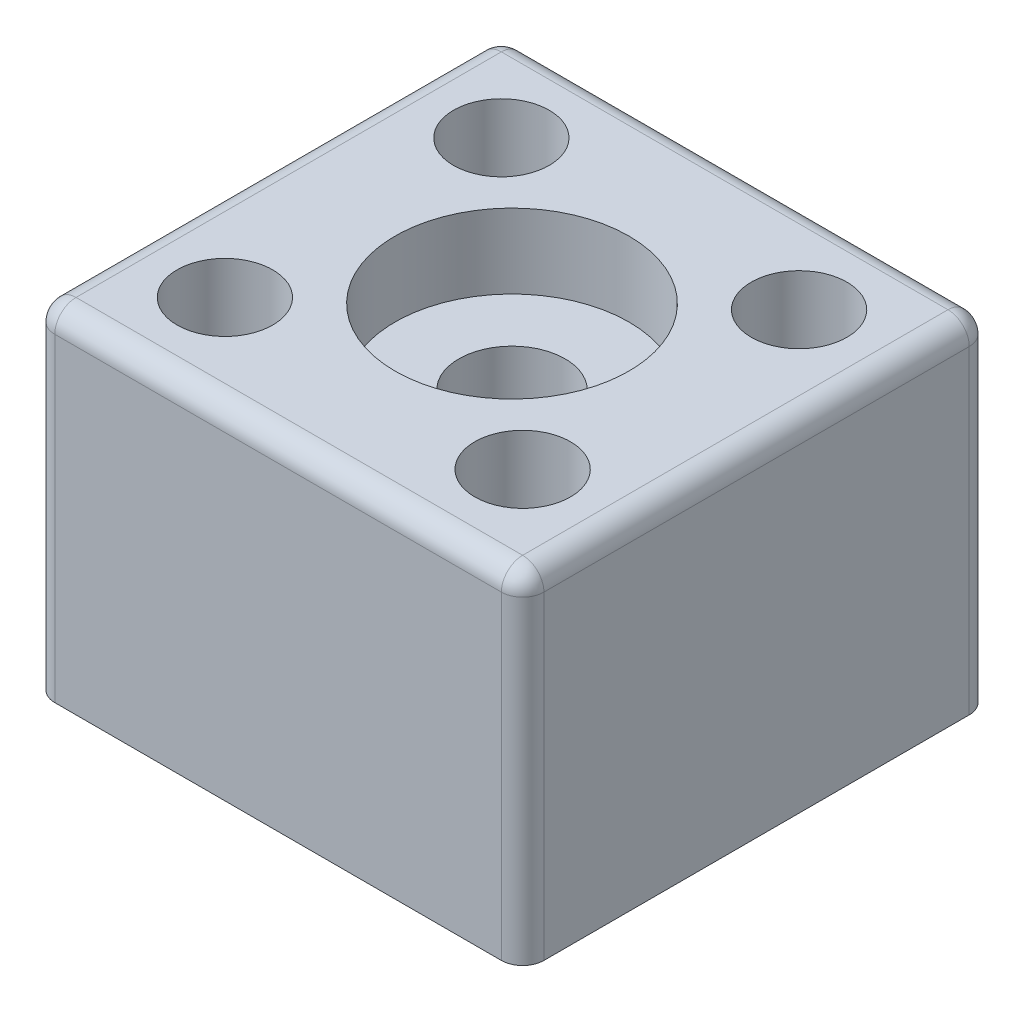
ISO-10303-21;
HEADER;
FILE_DESCRIPTION(('STEP AP214'),'2;1');
FILE_NAME('part.step','',(''),(''),'','','');
FILE_SCHEMA(('AUTOMOTIVE_DESIGN { 1 0 10303 214 1 1 1 1 }'));
ENDSEC;
DATA;
#1=APPLICATION_CONTEXT('core data for automotive mechanical design processes');
#2=APPLICATION_PROTOCOL_DEFINITION('international standard','automotive_design',2000,#1);
#3=PRODUCT_CONTEXT('',#1,'mechanical');
#4=PRODUCT('Part','Part','',(#3));
#5=PRODUCT_RELATED_PRODUCT_CATEGORY('part','',(#4));
#6=PRODUCT_DEFINITION_FORMATION('','',#4);
#7=PRODUCT_DEFINITION_CONTEXT('part definition',#1,'design');
#8=PRODUCT_DEFINITION('design','',#6,#7);
#9=PRODUCT_DEFINITION_SHAPE('','',#8);
#10=(LENGTH_UNIT() NAMED_UNIT(*) SI_UNIT(.MILLI.,.METRE.));
#11=(NAMED_UNIT(*) PLANE_ANGLE_UNIT() SI_UNIT($,.RADIAN.));
#12=(NAMED_UNIT(*) SI_UNIT($,.STERADIAN.) SOLID_ANGLE_UNIT());
#13=UNCERTAINTY_MEASURE_WITH_UNIT(LENGTH_MEASURE(1.E-05),#10,'distance_accuracy_value','');
#14=(GEOMETRIC_REPRESENTATION_CONTEXT(3) GLOBAL_UNCERTAINTY_ASSIGNED_CONTEXT((#13)) GLOBAL_UNIT_ASSIGNED_CONTEXT((#10,
#11,#12)) REPRESENTATION_CONTEXT('',''));
#15=CARTESIAN_POINT('',(0.,0.,0.));
#16=DIRECTION('',(0.,0.,1.));
#17=DIRECTION('',(1.,0.,0.));
#18=AXIS2_PLACEMENT_3D('',#15,#16,#17);
#19=CARTESIAN_POINT('',(14.,32.,-13.));
#20=DIRECTION('',(0.,-1.,0.));
#21=DIRECTION('',(0.,0.,-1.));
#22=AXIS2_PLACEMENT_3D('',#19,#20,#21);
#23=CYLINDRICAL_SURFACE('',#22,2.65);
#24=CARTESIAN_POINT('',(14.,0.,-13.));
#25=DIRECTION('',(0.,-1.,0.));
#26=DIRECTION('',(0.,0.,-1.));
#27=AXIS2_PLACEMENT_3D('',#24,#25,#26);
#28=CIRCLE('',#27,2.65);
#29=CARTESIAN_POINT('',(14.,0.,-15.65));
#30=VERTEX_POINT('',#29);
#31=EDGE_CURVE('E166',#30,#30,#28,.T.);
#32=ORIENTED_EDGE('',*,*,#31,.T.);
#33=EDGE_LOOP('',(#32));
#34=FACE_BOUND('',#33,.T.);
#35=CARTESIAN_POINT('',(14.,10.,-13.));
#36=DIRECTION('',(0.,1.,0.));
#37=DIRECTION('',(0.,0.,1.));
#38=AXIS2_PLACEMENT_3D('',#35,#36,#37);
#39=CIRCLE('',#38,2.65);
#40=CARTESIAN_POINT('',(14.,10.,-10.35));
#41=VERTEX_POINT('',#40);
#42=EDGE_CURVE('E280',#41,#41,#39,.F.);
#43=ORIENTED_EDGE('',*,*,#42,.F.);
#44=EDGE_LOOP('',(#43));
#45=FACE_BOUND('',#44,.T.);
#46=ADVANCED_FACE('F41',(#34,#45),#23,.F.);
#47=CARTESIAN_POINT('',(-14.,32.,-13.));
#48=DIRECTION('',(0.,-1.,0.));
#49=DIRECTION('',(0.,0.,-1.));
#50=AXIS2_PLACEMENT_3D('',#47,#48,#49);
#51=CYLINDRICAL_SURFACE('',#50,2.65);
#52=CARTESIAN_POINT('',(-14.,0.,-13.));
#53=DIRECTION('',(0.,-1.,0.));
#54=DIRECTION('',(0.,0.,-1.));
#55=AXIS2_PLACEMENT_3D('',#52,#53,#54);
#56=CIRCLE('',#55,2.65);
#57=CARTESIAN_POINT('',(-14.,0.,-15.65));
#58=VERTEX_POINT('',#57);
#59=EDGE_CURVE('E149',#58,#58,#56,.T.);
#60=ORIENTED_EDGE('',*,*,#59,.T.);
#61=EDGE_LOOP('',(#60));
#62=FACE_BOUND('',#61,.T.);
#63=CARTESIAN_POINT('',(-14.,10.,-13.));
#64=DIRECTION('',(0.,1.,0.));
#65=DIRECTION('',(0.,0.,1.));
#66=AXIS2_PLACEMENT_3D('',#63,#64,#65);
#67=CIRCLE('',#66,2.65);
#68=CARTESIAN_POINT('',(-14.,10.,-10.35));
#69=VERTEX_POINT('',#68);
#70=EDGE_CURVE('E276',#69,#69,#67,.F.);
#71=ORIENTED_EDGE('',*,*,#70,.F.);
#72=EDGE_LOOP('',(#71));
#73=FACE_BOUND('',#72,.T.);
#74=ADVANCED_FACE('F317',(#62,#73),#51,.F.);
#75=CARTESIAN_POINT('',(-14.,32.,13.));
#76=DIRECTION('',(0.,-1.,0.));
#77=DIRECTION('',(0.,0.,-1.));
#78=AXIS2_PLACEMENT_3D('',#75,#76,#77);
#79=CYLINDRICAL_SURFACE('',#78,2.65);
#80=CARTESIAN_POINT('',(-14.,0.,13.));
#81=DIRECTION('',(0.,-1.,0.));
#82=DIRECTION('',(0.,0.,-1.));
#83=AXIS2_PLACEMENT_3D('',#80,#81,#82);
#84=CIRCLE('',#83,2.65);
#85=CARTESIAN_POINT('',(-14.,0.,10.35));
#86=VERTEX_POINT('',#85);
#87=EDGE_CURVE('E156',#86,#86,#84,.T.);
#88=ORIENTED_EDGE('',*,*,#87,.T.);
#89=EDGE_LOOP('',(#88));
#90=FACE_BOUND('',#89,.T.);
#91=CARTESIAN_POINT('',(-14.,10.,13.));
#92=DIRECTION('',(0.,1.,0.));
#93=DIRECTION('',(0.,0.,1.));
#94=AXIS2_PLACEMENT_3D('',#91,#92,#93);
#95=CIRCLE('',#94,2.65);
#96=CARTESIAN_POINT('',(-14.,10.,15.65));
#97=VERTEX_POINT('',#96);
#98=EDGE_CURVE('E272',#97,#97,#95,.F.);
#99=ORIENTED_EDGE('',*,*,#98,.F.);
#100=EDGE_LOOP('',(#99));
#101=FACE_BOUND('',#100,.T.);
#102=ADVANCED_FACE('F306',(#90,#101),#79,.F.);
#103=CARTESIAN_POINT('',(14.,32.,13.));
#104=DIRECTION('',(0.,-1.,0.));
#105=DIRECTION('',(0.,0.,-1.));
#106=AXIS2_PLACEMENT_3D('',#103,#104,#105);
#107=CYLINDRICAL_SURFACE('',#106,2.65);
#108=CARTESIAN_POINT('',(14.,0.,13.));
#109=DIRECTION('',(0.,-1.,0.));
#110=DIRECTION('',(0.,0.,-1.));
#111=AXIS2_PLACEMENT_3D('',#108,#109,#110);
#112=CIRCLE('',#111,2.65);
#113=CARTESIAN_POINT('',(14.,0.,10.35));
#114=VERTEX_POINT('',#113);
#115=EDGE_CURVE('E170',#114,#114,#112,.T.);
#116=ORIENTED_EDGE('',*,*,#115,.T.);
#117=EDGE_LOOP('',(#116));
#118=FACE_BOUND('',#117,.T.);
#119=CARTESIAN_POINT('',(14.,10.,13.));
#120=DIRECTION('',(0.,1.,0.));
#121=DIRECTION('',(0.,0.,1.));
#122=AXIS2_PLACEMENT_3D('',#119,#120,#121);
#123=CIRCLE('',#122,2.65);
#124=CARTESIAN_POINT('',(14.,10.,15.65));
#125=VERTEX_POINT('',#124);
#126=EDGE_CURVE('E224',#125,#125,#123,.F.);
#127=ORIENTED_EDGE('',*,*,#126,.F.);
#128=EDGE_LOOP('',(#127));
#129=FACE_BOUND('',#128,.T.);
#130=ADVANCED_FACE('F349',(#118,#129),#107,.F.);
#131=CARTESIAN_POINT('',(23.,32.,-22.));
#132=DIRECTION('',(-1.,0.,0.));
#133=DIRECTION('',(0.,0.,1.));
#134=AXIS2_PLACEMENT_3D('',#131,#132,#133);
#135=PLANE('',#134);
#136=DIRECTION('',(0.,0.,-1.));
#137=VECTOR('',#136,1.);
#138=CARTESIAN_POINT('',(23.,30.,22.));
#139=LINE('',#138,#137);
#140=CARTESIAN_POINT('',(23.,30.,-20.));
#141=VERTEX_POINT('',#140);
#142=CARTESIAN_POINT('',(23.,30.,20.));
#143=VERTEX_POINT('',#142);
#144=EDGE_CURVE('E138',#141,#143,#139,.F.);
#145=ORIENTED_EDGE('',*,*,#144,.T.);
#146=DIRECTION('',(0.,-1.,0.));
#147=VECTOR('',#146,1.);
#148=CARTESIAN_POINT('',(23.,32.,20.));
#149=LINE('',#148,#147);
#150=CARTESIAN_POINT('',(23.,0.,20.));
#151=VERTEX_POINT('',#150);
#152=EDGE_CURVE('E122',#143,#151,#149,.T.);
#153=ORIENTED_EDGE('',*,*,#152,.T.);
#154=DIRECTION('',(0.,0.,-1.));
#155=VECTOR('',#154,1.);
#156=CARTESIAN_POINT('',(23.,0.,-22.));
#157=LINE('',#156,#155);
#158=CARTESIAN_POINT('',(23.,0.,-20.));
#159=VERTEX_POINT('',#158);
#160=EDGE_CURVE('E135',#151,#159,#157,.T.);
#161=ORIENTED_EDGE('',*,*,#160,.T.);
#162=DIRECTION('',(0.,-1.,0.));
#163=VECTOR('',#162,1.);
#164=CARTESIAN_POINT('',(23.,32.,-20.));
#165=LINE('',#164,#163);
#166=EDGE_CURVE('E174',#159,#141,#165,.F.);
#167=ORIENTED_EDGE('',*,*,#166,.T.);
#168=EDGE_LOOP('',(#145,#153,#161,#167));
#169=FACE_BOUND('',#168,.T.);
#170=ADVANCED_FACE('F134',(#169),#135,.F.);
#171=CARTESIAN_POINT('',(-23.,32.,-22.));
#172=DIRECTION('',(0.,0.,1.));
#173=DIRECTION('',(1.,0.,0.));
#174=AXIS2_PLACEMENT_3D('',#171,#172,#173);
#175=PLANE('',#174);
#176=DIRECTION('',(-1.,0.,0.));
#177=VECTOR('',#176,1.);
#178=CARTESIAN_POINT('',(-23.,0.,-22.));
#179=LINE('',#178,#177);
#180=CARTESIAN_POINT('',(21.,0.,-22.));
#181=VERTEX_POINT('',#180);
#182=CARTESIAN_POINT('',(-21.,0.,-22.));
#183=VERTEX_POINT('',#182);
#184=EDGE_CURVE('E148',#181,#183,#179,.T.);
#185=ORIENTED_EDGE('',*,*,#184,.T.);
#186=DIRECTION('',(0.,-1.,0.));
#187=VECTOR('',#186,1.);
#188=CARTESIAN_POINT('',(-21.,32.,-22.));
#189=LINE('',#188,#187);
#190=CARTESIAN_POINT('',(-21.,30.,-22.));
#191=VERTEX_POINT('',#190);
#192=EDGE_CURVE('E11',#183,#191,#189,.F.);
#193=ORIENTED_EDGE('',*,*,#192,.T.);
#194=DIRECTION('',(-1.,0.,0.));
#195=VECTOR('',#194,1.);
#196=CARTESIAN_POINT('',(23.,30.,-22.));
#197=LINE('',#196,#195);
#198=CARTESIAN_POINT('',(21.,30.,-22.));
#199=VERTEX_POINT('',#198);
#200=EDGE_CURVE('E51',#191,#199,#197,.F.);
#201=ORIENTED_EDGE('',*,*,#200,.T.);
#202=DIRECTION('',(0.,-1.,0.));
#203=VECTOR('',#202,1.);
#204=CARTESIAN_POINT('',(21.,32.,-22.));
#205=LINE('',#204,#203);
#206=EDGE_CURVE('E215',#199,#181,#205,.T.);
#207=ORIENTED_EDGE('',*,*,#206,.T.);
#208=EDGE_LOOP('',(#185,#193,#201,#207));
#209=FACE_BOUND('',#208,.T.);
#210=ADVANCED_FACE('F406',(#209),#175,.F.);
#211=CARTESIAN_POINT('',(-23.,32.,-22.));
#212=DIRECTION('',(1.,0.,0.));
#213=DIRECTION('',(0.,0.,-1.));
#214=AXIS2_PLACEMENT_3D('',#211,#212,#213);
#215=PLANE('',#214);
#216=DIRECTION('',(0.,0.,1.));
#217=VECTOR('',#216,1.);
#218=CARTESIAN_POINT('',(-23.,0.,-22.));
#219=LINE('',#218,#217);
#220=CARTESIAN_POINT('',(-23.,0.,-20.));
#221=VERTEX_POINT('',#220);
#222=CARTESIAN_POINT('',(-23.,0.,20.));
#223=VERTEX_POINT('',#222);
#224=EDGE_CURVE('E153',#221,#223,#219,.T.);
#225=ORIENTED_EDGE('',*,*,#224,.T.);
#226=DIRECTION('',(0.,-1.,0.));
#227=VECTOR('',#226,1.);
#228=CARTESIAN_POINT('',(-23.,32.,20.));
#229=LINE('',#228,#227);
#230=CARTESIAN_POINT('',(-23.,30.,20.));
#231=VERTEX_POINT('',#230);
#232=EDGE_CURVE('E212',#223,#231,#229,.F.);
#233=ORIENTED_EDGE('',*,*,#232,.T.);
#234=DIRECTION('',(0.,0.,1.));
#235=VECTOR('',#234,1.);
#236=CARTESIAN_POINT('',(-23.,30.,-22.));
#237=LINE('',#236,#235);
#238=CARTESIAN_POINT('',(-23.,30.,-20.));
#239=VERTEX_POINT('',#238);
#240=EDGE_CURVE('E209',#231,#239,#237,.F.);
#241=ORIENTED_EDGE('',*,*,#240,.T.);
#242=DIRECTION('',(0.,-1.,0.));
#243=VECTOR('',#242,1.);
#244=CARTESIAN_POINT('',(-23.,32.,-20.));
#245=LINE('',#244,#243);
#246=EDGE_CURVE('E206',#239,#221,#245,.T.);
#247=ORIENTED_EDGE('',*,*,#246,.T.);
#248=EDGE_LOOP('',(#225,#233,#241,#247));
#249=FACE_BOUND('',#248,.T.);
#250=ADVANCED_FACE('F411',(#249),#215,.F.);
#251=CARTESIAN_POINT('',(-23.,32.,22.));
#252=DIRECTION('',(0.,0.,-1.));
#253=DIRECTION('',(-1.,0.,0.));
#254=AXIS2_PLACEMENT_3D('',#251,#252,#253);
#255=PLANE('',#254);
#256=DIRECTION('',(1.,0.,0.));
#257=VECTOR('',#256,1.);
#258=CARTESIAN_POINT('',(-23.,0.,22.));
#259=LINE('',#258,#257);
#260=CARTESIAN_POINT('',(-21.,0.,22.));
#261=VERTEX_POINT('',#260);
#262=CARTESIAN_POINT('',(21.,0.,22.));
#263=VERTEX_POINT('',#262);
#264=EDGE_CURVE('E163',#261,#263,#259,.T.);
#265=ORIENTED_EDGE('',*,*,#264,.T.);
#266=DIRECTION('',(0.,-1.,0.));
#267=VECTOR('',#266,1.);
#268=CARTESIAN_POINT('',(21.,32.,22.));
#269=LINE('',#268,#267);
#270=CARTESIAN_POINT('',(21.,30.,22.));
#271=VERTEX_POINT('',#270);
#272=EDGE_CURVE('E123',#263,#271,#269,.F.);
#273=ORIENTED_EDGE('',*,*,#272,.T.);
#274=DIRECTION('',(1.,0.,0.));
#275=VECTOR('',#274,1.);
#276=CARTESIAN_POINT('',(-23.,30.,22.));
#277=LINE('',#276,#275);
#278=CARTESIAN_POINT('',(-21.,30.,22.));
#279=VERTEX_POINT('',#278);
#280=EDGE_CURVE('E188',#271,#279,#277,.F.);
#281=ORIENTED_EDGE('',*,*,#280,.T.);
#282=DIRECTION('',(0.,-1.,0.));
#283=VECTOR('',#282,1.);
#284=CARTESIAN_POINT('',(-21.,32.,22.));
#285=LINE('',#284,#283);
#286=EDGE_CURVE('E129',#279,#261,#285,.T.);
#287=ORIENTED_EDGE('',*,*,#286,.T.);
#288=EDGE_LOOP('',(#265,#273,#281,#287));
#289=FACE_BOUND('',#288,.T.);
#290=ADVANCED_FACE('F427',(#289),#255,.F.);
#291=CARTESIAN_POINT('',(0.,32.,0.));
#292=DIRECTION('',(0.,1.,0.));
#293=DIRECTION('',(0.,0.,1.));
#294=AXIS2_PLACEMENT_3D('',#291,#292,#293);
#295=PLANE('',#294);
#296=CARTESIAN_POINT('',(14.,32.,-13.));
#297=DIRECTION('',(0.,1.,0.));
#298=DIRECTION('',(0.,0.,1.));
#299=AXIS2_PLACEMENT_3D('',#296,#297,#298);
#300=CIRCLE('',#299,4.5);
#301=CARTESIAN_POINT('',(14.,32.,-8.5));
#302=VERTEX_POINT('',#301);
#303=EDGE_CURVE('E637',#302,#302,#300,.T.);
#304=ORIENTED_EDGE('',*,*,#303,.F.);
#305=EDGE_LOOP('',(#304));
#306=FACE_BOUND('',#305,.T.);
#307=CARTESIAN_POINT('',(-14.,32.,13.));
#308=DIRECTION('',(0.,1.,0.));
#309=DIRECTION('',(0.,0.,1.));
#310=AXIS2_PLACEMENT_3D('',#307,#308,#309);
#311=CIRCLE('',#310,4.5);
#312=CARTESIAN_POINT('',(-14.,32.,17.5));
#313=VERTEX_POINT('',#312);
#314=EDGE_CURVE('E638',#313,#313,#311,.T.);
#315=ORIENTED_EDGE('',*,*,#314,.F.);
#316=EDGE_LOOP('',(#315));
#317=FACE_BOUND('',#316,.T.);
#318=CARTESIAN_POINT('',(-14.,32.,-13.));
#319=DIRECTION('',(0.,1.,0.));
#320=DIRECTION('',(0.,0.,1.));
#321=AXIS2_PLACEMENT_3D('',#318,#319,#320);
#322=CIRCLE('',#321,4.5);
#323=CARTESIAN_POINT('',(-14.,32.,-8.5));
#324=VERTEX_POINT('',#323);
#325=EDGE_CURVE('E650',#324,#324,#322,.T.);
#326=ORIENTED_EDGE('',*,*,#325,.F.);
#327=EDGE_LOOP('',(#326));
#328=FACE_BOUND('',#327,.T.);
#329=CARTESIAN_POINT('',(14.,32.,13.));
#330=DIRECTION('',(0.,1.,0.));
#331=DIRECTION('',(0.,0.,1.));
#332=AXIS2_PLACEMENT_3D('',#329,#330,#331);
#333=CIRCLE('',#332,4.5);
#334=CARTESIAN_POINT('',(14.,32.,17.5));
#335=VERTEX_POINT('',#334);
#336=EDGE_CURVE('E283',#335,#335,#333,.T.);
#337=ORIENTED_EDGE('',*,*,#336,.F.);
#338=EDGE_LOOP('',(#337));
#339=FACE_BOUND('',#338,.T.);
#340=DIRECTION('',(0.,0.,1.));
#341=VECTOR('',#340,1.);
#342=CARTESIAN_POINT('',(-21.,32.,22.));
#343=LINE('',#342,#341);
#344=CARTESIAN_POINT('',(-21.,32.,-20.));
#345=VERTEX_POINT('',#344);
#346=CARTESIAN_POINT('',(-21.,32.,20.));
#347=VERTEX_POINT('',#346);
#348=EDGE_CURVE('E199',#345,#347,#343,.T.);
#349=ORIENTED_EDGE('',*,*,#348,.T.);
#350=DIRECTION('',(1.,0.,0.));
#351=VECTOR('',#350,1.);
#352=CARTESIAN_POINT('',(23.,32.,20.));
#353=LINE('',#352,#351);
#354=CARTESIAN_POINT('',(21.,32.,20.));
#355=VERTEX_POINT('',#354);
#356=EDGE_CURVE('E202',#347,#355,#353,.T.);
#357=ORIENTED_EDGE('',*,*,#356,.T.);
#358=DIRECTION('',(0.,0.,-1.));
#359=VECTOR('',#358,1.);
#360=CARTESIAN_POINT('',(21.,32.,-22.));
#361=LINE('',#360,#359);
#362=CARTESIAN_POINT('',(21.,32.,-20.));
#363=VERTEX_POINT('',#362);
#364=EDGE_CURVE('E196',#355,#363,#361,.T.);
#365=ORIENTED_EDGE('',*,*,#364,.T.);
#366=DIRECTION('',(-1.,0.,0.));
#367=VECTOR('',#366,1.);
#368=CARTESIAN_POINT('',(-23.,32.,-20.));
#369=LINE('',#368,#367);
#370=EDGE_CURVE('E193',#363,#345,#369,.T.);
#371=ORIENTED_EDGE('',*,*,#370,.T.);
#372=EDGE_LOOP('',(#349,#357,#365,#371));
#373=FACE_BOUND('',#372,.T.);
#374=CARTESIAN_POINT('',(0.,32.,0.));
#375=DIRECTION('',(0.,1.,0.));
#376=DIRECTION('',(0.,0.,1.));
#377=AXIS2_PLACEMENT_3D('',#374,#375,#376);
#378=CIRCLE('',#377,11.);
#379=CARTESIAN_POINT('',(0.,32.,11.));
#380=VERTEX_POINT('',#379);
#381=EDGE_CURVE('E267',#380,#380,#378,.T.);
#382=ORIENTED_EDGE('',*,*,#381,.F.);
#383=EDGE_LOOP('',(#382));
#384=FACE_BOUND('',#383,.T.);
#385=ADVANCED_FACE('F312',(#306,#317,#328,#339,#373,#384),#295,.T.);
#386=CARTESIAN_POINT('',(0.,0.,0.));
#387=DIRECTION('',(0.,1.,0.));
#388=DIRECTION('',(0.,0.,1.));
#389=AXIS2_PLACEMENT_3D('',#386,#387,#388);
#390=PLANE('',#389);
#391=CARTESIAN_POINT('',(0.,0.,0.));
#392=DIRECTION('',(0.,1.,0.));
#393=DIRECTION('',(0.,0.,1.));
#394=AXIS2_PLACEMENT_3D('',#391,#392,#393);
#395=CIRCLE('',#394,5.);
#396=CARTESIAN_POINT('',(0.,0.,5.));
#397=VERTEX_POINT('',#396);
#398=EDGE_CURVE('E657',#397,#397,#395,.T.);
#399=ORIENTED_EDGE('',*,*,#398,.T.);
#400=EDGE_LOOP('',(#399));
#401=FACE_BOUND('',#400,.T.);
#402=ORIENTED_EDGE('',*,*,#87,.F.);
#403=EDGE_LOOP('',(#402));
#404=FACE_BOUND('',#403,.T.);
#405=ORIENTED_EDGE('',*,*,#59,.F.);
#406=EDGE_LOOP('',(#405));
#407=FACE_BOUND('',#406,.T.);
#408=ORIENTED_EDGE('',*,*,#160,.F.);
#409=CARTESIAN_POINT('',(21.,0.,20.));
#410=DIRECTION('',(0.,1.,0.));
#411=DIRECTION('',(0.,0.,1.));
#412=AXIS2_PLACEMENT_3D('',#409,#410,#411);
#413=CIRCLE('',#412,2.);
#414=EDGE_CURVE('E118',#151,#263,#413,.F.);
#415=ORIENTED_EDGE('',*,*,#414,.T.);
#416=ORIENTED_EDGE('',*,*,#264,.F.);
#417=CARTESIAN_POINT('',(-21.,0.,20.));
#418=DIRECTION('',(0.,1.,0.));
#419=DIRECTION('',(0.,0.,1.));
#420=AXIS2_PLACEMENT_3D('',#417,#418,#419);
#421=CIRCLE('',#420,2.);
#422=EDGE_CURVE('E130',#261,#223,#421,.F.);
#423=ORIENTED_EDGE('',*,*,#422,.T.);
#424=ORIENTED_EDGE('',*,*,#224,.F.);
#425=CARTESIAN_POINT('',(-21.,0.,-20.));
#426=DIRECTION('',(0.,1.,0.));
#427=DIRECTION('',(0.,0.,1.));
#428=AXIS2_PLACEMENT_3D('',#425,#426,#427);
#429=CIRCLE('',#428,2.);
#430=EDGE_CURVE('E181',#221,#183,#429,.F.);
#431=ORIENTED_EDGE('',*,*,#430,.T.);
#432=ORIENTED_EDGE('',*,*,#184,.F.);
#433=CARTESIAN_POINT('',(21.,0.,-20.));
#434=DIRECTION('',(0.,1.,0.));
#435=DIRECTION('',(0.,0.,1.));
#436=AXIS2_PLACEMENT_3D('',#433,#434,#435);
#437=CIRCLE('',#436,2.);
#438=EDGE_CURVE('E141',#181,#159,#437,.F.);
#439=ORIENTED_EDGE('',*,*,#438,.T.);
#440=EDGE_LOOP('',(#408,#415,#416,#423,#424,#431,#432,#439));
#441=FACE_BOUND('',#440,.T.);
#442=ORIENTED_EDGE('',*,*,#31,.F.);
#443=EDGE_LOOP('',(#442));
#444=FACE_BOUND('',#443,.T.);
#445=ORIENTED_EDGE('',*,*,#115,.F.);
#446=EDGE_LOOP('',(#445));
#447=FACE_BOUND('',#446,.T.);
#448=ADVANCED_FACE('F143',(#401,#404,#407,#441,#444,#447),#390,.F.);
#449=CARTESIAN_POINT('',(0.,25.,0.));
#450=DIRECTION('',(0.,1.,0.));
#451=DIRECTION('',(0.,0.,1.));
#452=AXIS2_PLACEMENT_3D('',#449,#450,#451);
#453=CYLINDRICAL_SURFACE('',#452,11.);
#454=CARTESIAN_POINT('',(0.,25.,0.));
#455=DIRECTION('',(0.,1.,0.));
#456=DIRECTION('',(0.,0.,1.));
#457=AXIS2_PLACEMENT_3D('',#454,#455,#456);
#458=CIRCLE('',#457,11.);
#459=CARTESIAN_POINT('',(0.,25.,11.));
#460=VERTEX_POINT('',#459);
#461=EDGE_CURVE('E296',#460,#460,#458,.T.);
#462=ORIENTED_EDGE('',*,*,#461,.F.);
#463=EDGE_LOOP('',(#462));
#464=FACE_BOUND('',#463,.T.);
#465=ORIENTED_EDGE('',*,*,#381,.T.);
#466=EDGE_LOOP('',(#465));
#467=FACE_BOUND('',#466,.T.);
#468=ADVANCED_FACE('F311',(#464,#467),#453,.F.);
#469=CARTESIAN_POINT('',(0.,25.,0.));
#470=DIRECTION('',(0.,1.,0.));
#471=DIRECTION('',(0.,0.,1.));
#472=AXIS2_PLACEMENT_3D('',#469,#470,#471);
#473=PLANE('',#472);
#474=CARTESIAN_POINT('',(0.,25.,0.));
#475=DIRECTION('',(0.,1.,0.));
#476=DIRECTION('',(0.,0.,1.));
#477=AXIS2_PLACEMENT_3D('',#474,#475,#476);
#478=CIRCLE('',#477,5.);
#479=CARTESIAN_POINT('',(0.,25.,5.));
#480=VERTEX_POINT('',#479);
#481=EDGE_CURVE('E45',#480,#480,#478,.T.);
#482=ORIENTED_EDGE('',*,*,#481,.F.);
#483=EDGE_LOOP('',(#482));
#484=FACE_BOUND('',#483,.T.);
#485=ORIENTED_EDGE('',*,*,#461,.T.);
#486=EDGE_LOOP('',(#485));
#487=FACE_BOUND('',#486,.T.);
#488=ADVANCED_FACE('F397',(#484,#487),#473,.T.);
#489=CARTESIAN_POINT('',(-21.,32.,-20.));
#490=DIRECTION('',(0.,-1.,0.));
#491=DIRECTION('',(0.,0.,-1.));
#492=AXIS2_PLACEMENT_3D('',#489,#490,#491);
#493=CYLINDRICAL_SURFACE('',#492,2.);
#494=CARTESIAN_POINT('',(-21.,30.,-20.));
#495=DIRECTION('',(0.,1.,0.));
#496=DIRECTION('',(0.,0.,1.));
#497=AXIS2_PLACEMENT_3D('',#494,#495,#496);
#498=CIRCLE('',#497,2.);
#499=EDGE_CURVE('E263',#191,#239,#498,.T.);
#500=ORIENTED_EDGE('',*,*,#499,.F.);
#501=ORIENTED_EDGE('',*,*,#192,.F.);
#502=ORIENTED_EDGE('',*,*,#430,.F.);
#503=ORIENTED_EDGE('',*,*,#246,.F.);
#504=EDGE_LOOP('',(#500,#501,#502,#503));
#505=FACE_BOUND('',#504,.T.);
#506=ADVANCED_FACE('F43',(#505),#493,.T.);
#507=CARTESIAN_POINT('',(-21.,30.,-20.));
#508=DIRECTION('',(-1.,0.,0.));
#509=DIRECTION('',(0.,0.,1.));
#510=AXIS2_PLACEMENT_3D('',#507,#508,#509);
#511=SPHERICAL_SURFACE('',#510,2.);
#512=CARTESIAN_POINT('',(-21.,30.,-20.));
#513=DIRECTION('',(-1.,0.,0.));
#514=DIRECTION('',(0.,0.,1.));
#515=AXIS2_PLACEMENT_3D('',#512,#513,#514);
#516=CIRCLE('',#515,2.);
#517=EDGE_CURVE('E255',#191,#345,#516,.F.);
#518=ORIENTED_EDGE('',*,*,#517,.F.);
#519=ORIENTED_EDGE('',*,*,#499,.T.);
#520=CARTESIAN_POINT('',(-21.,30.,-20.));
#521=DIRECTION('',(0.,0.,-1.));
#522=DIRECTION('',(-1.,0.,0.));
#523=AXIS2_PLACEMENT_3D('',#520,#521,#522);
#524=CIRCLE('',#523,2.);
#525=EDGE_CURVE('E259',#345,#239,#524,.F.);
#526=ORIENTED_EDGE('',*,*,#525,.F.);
#527=EDGE_LOOP('',(#518,#519,#526));
#528=FACE_BOUND('',#527,.T.);
#529=ADVANCED_FACE('F390',(#528),#511,.T.);
#530=CARTESIAN_POINT('',(-21.,32.,20.));
#531=DIRECTION('',(0.,-1.,0.));
#532=DIRECTION('',(0.,0.,-1.));
#533=AXIS2_PLACEMENT_3D('',#530,#531,#532);
#534=CYLINDRICAL_SURFACE('',#533,2.);
#535=ORIENTED_EDGE('',*,*,#422,.F.);
#536=ORIENTED_EDGE('',*,*,#286,.F.);
#537=CARTESIAN_POINT('',(-21.,30.,20.));
#538=DIRECTION('',(0.,1.,0.));
#539=DIRECTION('',(0.,0.,1.));
#540=AXIS2_PLACEMENT_3D('',#537,#538,#539);
#541=CIRCLE('',#540,2.);
#542=EDGE_CURVE('E251',#231,#279,#541,.T.);
#543=ORIENTED_EDGE('',*,*,#542,.F.);
#544=ORIENTED_EDGE('',*,*,#232,.F.);
#545=EDGE_LOOP('',(#535,#536,#543,#544));
#546=FACE_BOUND('',#545,.T.);
#547=ADVANCED_FACE('F387',(#546),#534,.T.);
#548=CARTESIAN_POINT('',(-21.,30.,0.));
#549=DIRECTION('',(0.,0.,-1.));
#550=DIRECTION('',(-1.,0.,0.));
#551=AXIS2_PLACEMENT_3D('',#548,#549,#550);
#552=CYLINDRICAL_SURFACE('',#551,2.);
#553=ORIENTED_EDGE('',*,*,#525,.T.);
#554=ORIENTED_EDGE('',*,*,#240,.F.);
#555=CARTESIAN_POINT('',(-21.,30.,20.));
#556=DIRECTION('',(0.,0.,1.));
#557=DIRECTION('',(1.,0.,0.));
#558=AXIS2_PLACEMENT_3D('',#555,#556,#557);
#559=CIRCLE('',#558,2.);
#560=EDGE_CURVE('E247',#347,#231,#559,.T.);
#561=ORIENTED_EDGE('',*,*,#560,.F.);
#562=ORIENTED_EDGE('',*,*,#348,.F.);
#563=EDGE_LOOP('',(#553,#554,#561,#562));
#564=FACE_BOUND('',#563,.T.);
#565=ADVANCED_FACE('F383',(#564),#552,.T.);
#566=CARTESIAN_POINT('',(0.,30.,-20.));
#567=DIRECTION('',(1.,0.,0.));
#568=DIRECTION('',(0.,0.,-1.));
#569=AXIS2_PLACEMENT_3D('',#566,#567,#568);
#570=CYLINDRICAL_SURFACE('',#569,2.);
#571=ORIENTED_EDGE('',*,*,#517,.T.);
#572=ORIENTED_EDGE('',*,*,#370,.F.);
#573=CARTESIAN_POINT('',(21.,30.,-20.));
#574=DIRECTION('',(1.,0.,0.));
#575=DIRECTION('',(0.,1.,0.));
#576=AXIS2_PLACEMENT_3D('',#573,#574,#575);
#577=CIRCLE('',#576,2.);
#578=EDGE_CURVE('E243',#199,#363,#577,.T.);
#579=ORIENTED_EDGE('',*,*,#578,.F.);
#580=ORIENTED_EDGE('',*,*,#200,.F.);
#581=EDGE_LOOP('',(#571,#572,#579,#580));
#582=FACE_BOUND('',#581,.T.);
#583=ADVANCED_FACE('F379',(#582),#570,.T.);
#584=CARTESIAN_POINT('',(21.,32.,-20.));
#585=DIRECTION('',(0.,-1.,0.));
#586=DIRECTION('',(0.,0.,-1.));
#587=AXIS2_PLACEMENT_3D('',#584,#585,#586);
#588=CYLINDRICAL_SURFACE('',#587,2.);
#589=ORIENTED_EDGE('',*,*,#438,.F.);
#590=ORIENTED_EDGE('',*,*,#206,.F.);
#591=CARTESIAN_POINT('',(21.,30.,-20.));
#592=DIRECTION('',(0.,1.,0.));
#593=DIRECTION('',(0.,0.,1.));
#594=AXIS2_PLACEMENT_3D('',#591,#592,#593);
#595=CIRCLE('',#594,2.);
#596=EDGE_CURVE('E239',#141,#199,#595,.T.);
#597=ORIENTED_EDGE('',*,*,#596,.F.);
#598=ORIENTED_EDGE('',*,*,#166,.F.);
#599=EDGE_LOOP('',(#589,#590,#597,#598));
#600=FACE_BOUND('',#599,.T.);
#601=ADVANCED_FACE('F375',(#600),#588,.T.);
#602=CARTESIAN_POINT('',(-21.,30.,20.));
#603=DIRECTION('',(-1.,0.,0.));
#604=DIRECTION('',(0.,0.,1.));
#605=AXIS2_PLACEMENT_3D('',#602,#603,#604);
#606=SPHERICAL_SURFACE('',#605,2.);
#607=ORIENTED_EDGE('',*,*,#560,.T.);
#608=ORIENTED_EDGE('',*,*,#542,.T.);
#609=CARTESIAN_POINT('',(-21.,30.,20.));
#610=DIRECTION('',(-1.,0.,0.));
#611=DIRECTION('',(0.,0.,1.));
#612=AXIS2_PLACEMENT_3D('',#609,#610,#611);
#613=CIRCLE('',#612,2.);
#614=EDGE_CURVE('E235',#347,#279,#613,.F.);
#615=ORIENTED_EDGE('',*,*,#614,.F.);
#616=EDGE_LOOP('',(#607,#608,#615));
#617=FACE_BOUND('',#616,.T.);
#618=ADVANCED_FACE('F371',(#617),#606,.T.);
#619=CARTESIAN_POINT('',(21.,30.,-20.));
#620=DIRECTION('',(0.,0.,-1.));
#621=DIRECTION('',(-1.,0.,0.));
#622=AXIS2_PLACEMENT_3D('',#619,#620,#621);
#623=SPHERICAL_SURFACE('',#622,2.);
#624=ORIENTED_EDGE('',*,*,#596,.T.);
#625=ORIENTED_EDGE('',*,*,#578,.T.);
#626=CARTESIAN_POINT('',(21.,30.,-20.));
#627=DIRECTION('',(0.,0.,-1.));
#628=DIRECTION('',(-1.,0.,0.));
#629=AXIS2_PLACEMENT_3D('',#626,#627,#628);
#630=CIRCLE('',#629,2.);
#631=EDGE_CURVE('E231',#141,#363,#630,.F.);
#632=ORIENTED_EDGE('',*,*,#631,.F.);
#633=EDGE_LOOP('',(#624,#625,#632));
#634=FACE_BOUND('',#633,.T.);
#635=ADVANCED_FACE('F367',(#634),#623,.T.);
#636=CARTESIAN_POINT('',(0.,30.,20.));
#637=DIRECTION('',(-1.,0.,0.));
#638=DIRECTION('',(0.,0.,1.));
#639=AXIS2_PLACEMENT_3D('',#636,#637,#638);
#640=CYLINDRICAL_SURFACE('',#639,2.);
#641=ORIENTED_EDGE('',*,*,#614,.T.);
#642=ORIENTED_EDGE('',*,*,#280,.F.);
#643=CARTESIAN_POINT('',(21.,30.,20.));
#644=DIRECTION('',(1.,0.,0.));
#645=DIRECTION('',(0.,0.,-1.));
#646=AXIS2_PLACEMENT_3D('',#643,#644,#645);
#647=CIRCLE('',#646,2.);
#648=EDGE_CURVE('E227',#355,#271,#647,.T.);
#649=ORIENTED_EDGE('',*,*,#648,.F.);
#650=ORIENTED_EDGE('',*,*,#356,.F.);
#651=EDGE_LOOP('',(#641,#642,#649,#650));
#652=FACE_BOUND('',#651,.T.);
#653=ADVANCED_FACE('F363',(#652),#640,.T.);
#654=CARTESIAN_POINT('',(21.,30.,0.));
#655=DIRECTION('',(0.,0.,1.));
#656=DIRECTION('',(1.,0.,0.));
#657=AXIS2_PLACEMENT_3D('',#654,#655,#656);
#658=CYLINDRICAL_SURFACE('',#657,2.);
#659=ORIENTED_EDGE('',*,*,#631,.T.);
#660=ORIENTED_EDGE('',*,*,#364,.F.);
#661=CARTESIAN_POINT('',(21.,30.,20.));
#662=DIRECTION('',(0.,0.,1.));
#663=DIRECTION('',(0.,-1.,0.));
#664=AXIS2_PLACEMENT_3D('',#661,#662,#663);
#665=CIRCLE('',#664,2.);
#666=EDGE_CURVE('E223',#143,#355,#665,.T.);
#667=ORIENTED_EDGE('',*,*,#666,.F.);
#668=ORIENTED_EDGE('',*,*,#144,.F.);
#669=EDGE_LOOP('',(#659,#660,#667,#668));
#670=FACE_BOUND('',#669,.T.);
#671=ADVANCED_FACE('F359',(#670),#658,.T.);
#672=CARTESIAN_POINT('',(21.,30.,20.));
#673=DIRECTION('',(0.,1.,0.));
#674=DIRECTION('',(0.,0.,1.));
#675=AXIS2_PLACEMENT_3D('',#672,#673,#674);
#676=SPHERICAL_SURFACE('',#675,2.);
#677=ORIENTED_EDGE('',*,*,#666,.T.);
#678=ORIENTED_EDGE('',*,*,#648,.T.);
#679=CARTESIAN_POINT('',(21.,30.,20.));
#680=DIRECTION('',(0.,1.,0.));
#681=DIRECTION('',(0.,0.,1.));
#682=AXIS2_PLACEMENT_3D('',#679,#680,#681);
#683=CIRCLE('',#682,2.);
#684=EDGE_CURVE('E220',#143,#271,#683,.F.);
#685=ORIENTED_EDGE('',*,*,#684,.F.);
#686=EDGE_LOOP('',(#677,#678,#685));
#687=FACE_BOUND('',#686,.T.);
#688=ADVANCED_FACE('F356',(#687),#676,.T.);
#689=CARTESIAN_POINT('',(21.,32.,20.));
#690=DIRECTION('',(0.,-1.,0.));
#691=DIRECTION('',(0.,0.,-1.));
#692=AXIS2_PLACEMENT_3D('',#689,#690,#691);
#693=CYLINDRICAL_SURFACE('',#692,2.);
#694=ORIENTED_EDGE('',*,*,#684,.T.);
#695=ORIENTED_EDGE('',*,*,#272,.F.);
#696=ORIENTED_EDGE('',*,*,#414,.F.);
#697=ORIENTED_EDGE('',*,*,#152,.F.);
#698=EDGE_LOOP('',(#694,#695,#696,#697));
#699=FACE_BOUND('',#698,.T.);
#700=ADVANCED_FACE('F121',(#699),#693,.T.);
#701=CARTESIAN_POINT('',(14.,10.,13.));
#702=DIRECTION('',(0.,1.,0.));
#703=DIRECTION('',(0.,0.,1.));
#704=AXIS2_PLACEMENT_3D('',#701,#702,#703);
#705=PLANE('',#704);
#706=CARTESIAN_POINT('',(14.,10.,13.));
#707=DIRECTION('',(0.,1.,0.));
#708=DIRECTION('',(0.,0.,1.));
#709=AXIS2_PLACEMENT_3D('',#706,#707,#708);
#710=CIRCLE('',#709,4.5);
#711=CARTESIAN_POINT('',(14.,10.,17.5));
#712=VERTEX_POINT('',#711);
#713=EDGE_CURVE('E271',#712,#712,#710,.T.);
#714=ORIENTED_EDGE('',*,*,#713,.T.);
#715=EDGE_LOOP('',(#714));
#716=FACE_BOUND('',#715,.T.);
#717=ORIENTED_EDGE('',*,*,#126,.T.);
#718=EDGE_LOOP('',(#717));
#719=FACE_BOUND('',#718,.T.);
#720=ADVANCED_FACE('F355',(#716,#719),#705,.T.);
#721=CARTESIAN_POINT('',(14.,10.,13.));
#722=DIRECTION('',(0.,1.,0.));
#723=DIRECTION('',(0.,0.,1.));
#724=AXIS2_PLACEMENT_3D('',#721,#722,#723);
#725=CYLINDRICAL_SURFACE('',#724,4.5);
#726=ORIENTED_EDGE('',*,*,#713,.F.);
#727=EDGE_LOOP('',(#726));
#728=FACE_BOUND('',#727,.T.);
#729=ORIENTED_EDGE('',*,*,#336,.T.);
#730=EDGE_LOOP('',(#729));
#731=FACE_BOUND('',#730,.T.);
#732=ADVANCED_FACE('F480',(#728,#731),#725,.F.);
#733=CARTESIAN_POINT('',(-14.,10.,13.));
#734=DIRECTION('',(0.,1.,0.));
#735=DIRECTION('',(0.,0.,1.));
#736=AXIS2_PLACEMENT_3D('',#733,#734,#735);
#737=PLANE('',#736);
#738=CARTESIAN_POINT('',(-14.,10.,13.));
#739=DIRECTION('',(0.,1.,0.));
#740=DIRECTION('',(0.,0.,1.));
#741=AXIS2_PLACEMENT_3D('',#738,#739,#740);
#742=CIRCLE('',#741,4.5);
#743=CARTESIAN_POINT('',(-14.,10.,17.5));
#744=VERTEX_POINT('',#743);
#745=EDGE_CURVE('E634',#744,#744,#742,.T.);
#746=ORIENTED_EDGE('',*,*,#745,.T.);
#747=EDGE_LOOP('',(#746));
#748=FACE_BOUND('',#747,.T.);
#749=ORIENTED_EDGE('',*,*,#98,.T.);
#750=EDGE_LOOP('',(#749));
#751=FACE_BOUND('',#750,.T.);
#752=ADVANCED_FACE('F336',(#748,#751),#737,.T.);
#753=CARTESIAN_POINT('',(-14.,10.,13.));
#754=DIRECTION('',(0.,1.,0.));
#755=DIRECTION('',(0.,0.,1.));
#756=AXIS2_PLACEMENT_3D('',#753,#754,#755);
#757=CYLINDRICAL_SURFACE('',#756,4.5);
#758=ORIENTED_EDGE('',*,*,#745,.F.);
#759=EDGE_LOOP('',(#758));
#760=FACE_BOUND('',#759,.T.);
#761=ORIENTED_EDGE('',*,*,#314,.T.);
#762=EDGE_LOOP('',(#761));
#763=FACE_BOUND('',#762,.T.);
#764=ADVANCED_FACE('F326',(#760,#763),#757,.F.);
#765=CARTESIAN_POINT('',(-14.,10.,-13.));
#766=DIRECTION('',(0.,1.,0.));
#767=DIRECTION('',(0.,0.,1.));
#768=AXIS2_PLACEMENT_3D('',#765,#766,#767);
#769=PLANE('',#768);
#770=CARTESIAN_POINT('',(-14.,10.,-13.));
#771=DIRECTION('',(0.,1.,0.));
#772=DIRECTION('',(0.,0.,1.));
#773=AXIS2_PLACEMENT_3D('',#770,#771,#772);
#774=CIRCLE('',#773,4.5);
#775=CARTESIAN_POINT('',(-14.,10.,-8.5));
#776=VERTEX_POINT('',#775);
#777=EDGE_CURVE('E645',#776,#776,#774,.T.);
#778=ORIENTED_EDGE('',*,*,#777,.T.);
#779=EDGE_LOOP('',(#778));
#780=FACE_BOUND('',#779,.T.);
#781=ORIENTED_EDGE('',*,*,#70,.T.);
#782=EDGE_LOOP('',(#781));
#783=FACE_BOUND('',#782,.T.);
#784=ADVANCED_FACE('F323',(#780,#783),#769,.T.);
#785=CARTESIAN_POINT('',(-14.,10.,-13.));
#786=DIRECTION('',(0.,1.,0.));
#787=DIRECTION('',(0.,0.,1.));
#788=AXIS2_PLACEMENT_3D('',#785,#786,#787);
#789=CYLINDRICAL_SURFACE('',#788,4.5);
#790=ORIENTED_EDGE('',*,*,#777,.F.);
#791=EDGE_LOOP('',(#790));
#792=FACE_BOUND('',#791,.T.);
#793=ORIENTED_EDGE('',*,*,#325,.T.);
#794=EDGE_LOOP('',(#793));
#795=FACE_BOUND('',#794,.T.);
#796=ADVANCED_FACE('F325',(#792,#795),#789,.F.);
#797=CARTESIAN_POINT('',(14.,10.,-13.));
#798=DIRECTION('',(0.,1.,0.));
#799=DIRECTION('',(0.,0.,1.));
#800=AXIS2_PLACEMENT_3D('',#797,#798,#799);
#801=PLANE('',#800);
#802=CARTESIAN_POINT('',(14.,10.,-13.));
#803=DIRECTION('',(0.,1.,0.));
#804=DIRECTION('',(0.,0.,1.));
#805=AXIS2_PLACEMENT_3D('',#802,#803,#804);
#806=CIRCLE('',#805,4.5);
#807=CARTESIAN_POINT('',(14.,10.,-8.5));
#808=VERTEX_POINT('',#807);
#809=EDGE_CURVE('E277',#808,#808,#806,.T.);
#810=ORIENTED_EDGE('',*,*,#809,.T.);
#811=EDGE_LOOP('',(#810));
#812=FACE_BOUND('',#811,.T.);
#813=ORIENTED_EDGE('',*,*,#42,.T.);
#814=EDGE_LOOP('',(#813));
#815=FACE_BOUND('',#814,.T.);
#816=ADVANCED_FACE('F333',(#812,#815),#801,.T.);
#817=CARTESIAN_POINT('',(14.,10.,-13.));
#818=DIRECTION('',(0.,1.,0.));
#819=DIRECTION('',(0.,0.,1.));
#820=AXIS2_PLACEMENT_3D('',#817,#818,#819);
#821=CYLINDRICAL_SURFACE('',#820,4.5);
#822=ORIENTED_EDGE('',*,*,#809,.F.);
#823=EDGE_LOOP('',(#822));
#824=FACE_BOUND('',#823,.T.);
#825=ORIENTED_EDGE('',*,*,#303,.T.);
#826=EDGE_LOOP('',(#825));
#827=FACE_BOUND('',#826,.T.);
#828=ADVANCED_FACE('F581',(#824,#827),#821,.F.);
#829=CARTESIAN_POINT('',(0.,0.,0.));
#830=DIRECTION('',(0.,1.,0.));
#831=DIRECTION('',(0.,0.,1.));
#832=AXIS2_PLACEMENT_3D('',#829,#830,#831);
#833=CYLINDRICAL_SURFACE('',#832,5.);
#834=ORIENTED_EDGE('',*,*,#481,.T.);
#835=EDGE_LOOP('',(#834));
#836=FACE_BOUND('',#835,.T.);
#837=ORIENTED_EDGE('',*,*,#398,.F.);
#838=EDGE_LOOP('',(#837));
#839=FACE_BOUND('',#838,.T.);
#840=ADVANCED_FACE('F591',(#836,#839),#833,.F.);
#841=CLOSED_SHELL('',(#46,#74,#102,#130,#170,#210,#250,#290,#385,#448,#468,#488,#506,#529,#547,
#565,#583,#601,#618,#635,#653,#671,#688,#700,#720,#732,#752,#764,#784,#796,#816,#828,#840));
#842=MANIFOLD_SOLID_BREP('B2',#841);
#843=ADVANCED_BREP_SHAPE_REPRESENTATION('',(#18,#842),#14);
#844=SHAPE_DEFINITION_REPRESENTATION(#9,#843);
ENDSEC;
END-ISO-10303-21;
